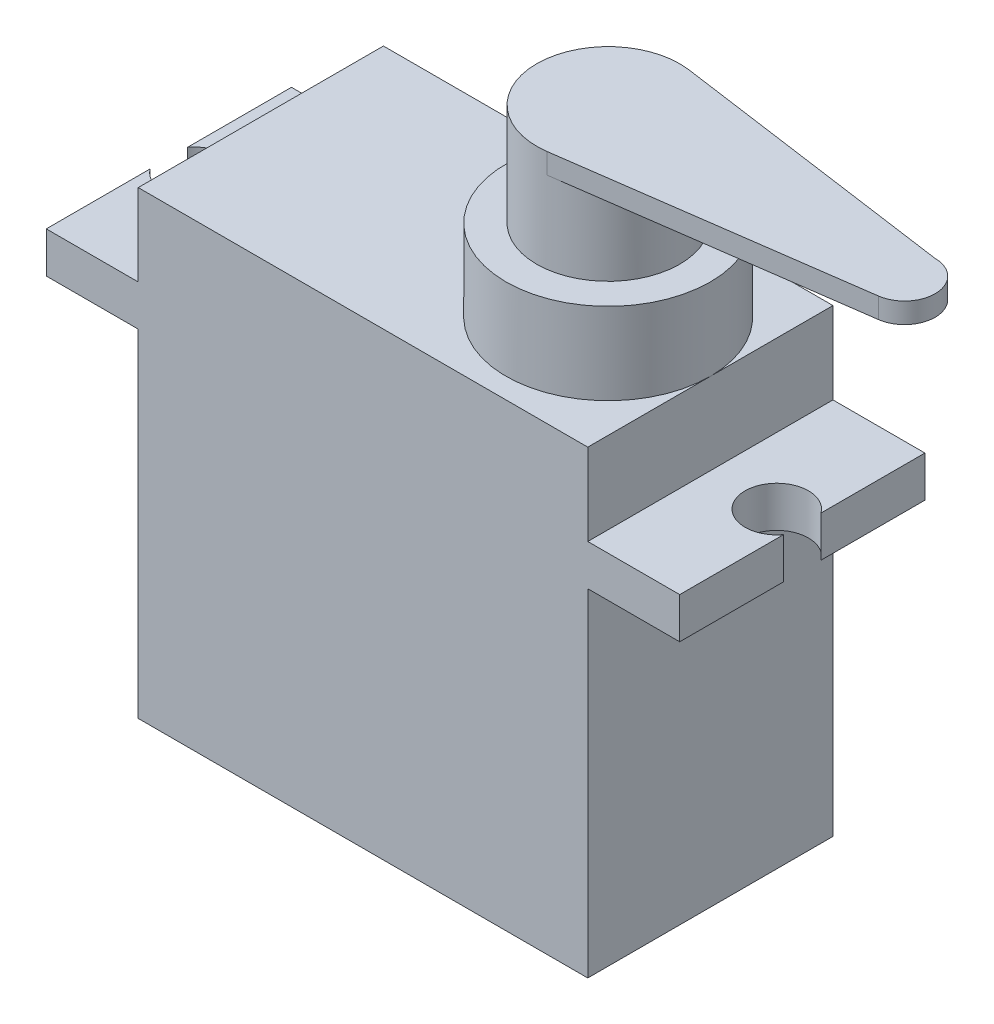
ISO-10303-21;
HEADER;
FILE_DESCRIPTION(('STEP AP214'),'2;1');
FILE_NAME('part.step','',(''),(''),'','','');
FILE_SCHEMA(('AUTOMOTIVE_DESIGN { 1 0 10303 214 1 1 1 1 }'));
ENDSEC;
DATA;
#1=APPLICATION_CONTEXT('core data for automotive mechanical design processes');
#2=APPLICATION_PROTOCOL_DEFINITION('international standard','automotive_design',2000,#1);
#3=PRODUCT_CONTEXT('',#1,'mechanical');
#4=PRODUCT('Part','Part','',(#3));
#5=PRODUCT_RELATED_PRODUCT_CATEGORY('part','',(#4));
#6=PRODUCT_DEFINITION_FORMATION('','',#4);
#7=PRODUCT_DEFINITION_CONTEXT('part definition',#1,'design');
#8=PRODUCT_DEFINITION('design','',#6,#7);
#9=PRODUCT_DEFINITION_SHAPE('','',#8);
#10=(LENGTH_UNIT() NAMED_UNIT(*) SI_UNIT(.MILLI.,.METRE.));
#11=(NAMED_UNIT(*) PLANE_ANGLE_UNIT() SI_UNIT($,.RADIAN.));
#12=(NAMED_UNIT(*) SI_UNIT($,.STERADIAN.) SOLID_ANGLE_UNIT());
#13=UNCERTAINTY_MEASURE_WITH_UNIT(LENGTH_MEASURE(1.E-05),#10,'distance_accuracy_value','');
#14=(GEOMETRIC_REPRESENTATION_CONTEXT(3) GLOBAL_UNCERTAINTY_ASSIGNED_CONTEXT((#13)) GLOBAL_UNIT_ASSIGNED_CONTEXT((#10,
#11,#12)) REPRESENTATION_CONTEXT('',''));
#15=CARTESIAN_POINT('',(0.,0.,0.));
#16=DIRECTION('',(0.,0.,1.));
#17=DIRECTION('',(1.,0.,0.));
#18=AXIS2_PLACEMENT_3D('',#15,#16,#17);
#19=CARTESIAN_POINT('',(-14.25,18.5,0.));
#20=DIRECTION('',(0.,1.,0.));
#21=DIRECTION('',(0.,0.,1.));
#22=AXIS2_PLACEMENT_3D('',#19,#20,#21);
#23=PLANE('',#22);
#24=DIRECTION('',(0.,0.,1.));
#25=VECTOR('',#24,1.);
#26=CARTESIAN_POINT('',(-11.,18.5,-6.));
#27=LINE('',#26,#25);
#28=CARTESIAN_POINT('',(-11.,18.5,-6.));
#29=VERTEX_POINT('',#28);
#30=CARTESIAN_POINT('',(-11.,18.5,6.));
#31=VERTEX_POINT('',#30);
#32=EDGE_CURVE('E214',#29,#31,#27,.T.);
#33=ORIENTED_EDGE('',*,*,#32,.F.);
#34=DIRECTION('',(-1.,0.,0.));
#35=VECTOR('',#34,1.);
#36=CARTESIAN_POINT('',(-15.5,18.5,-6.));
#37=LINE('',#36,#35);
#38=CARTESIAN_POINT('',(-15.5,18.5,-6.));
#39=VERTEX_POINT('',#38);
#40=EDGE_CURVE('E245',#29,#39,#37,.T.);
#41=ORIENTED_EDGE('',*,*,#40,.T.);
#42=DIRECTION('',(0.,0.,1.));
#43=VECTOR('',#42,1.);
#44=CARTESIAN_POINT('',(-15.5,18.5,-6.));
#45=LINE('',#44,#43);
#46=CARTESIAN_POINT('',(-15.5,18.5,-0.916515138991163));
#47=VERTEX_POINT('',#46);
#48=EDGE_CURVE('E248',#39,#47,#45,.T.);
#49=ORIENTED_EDGE('',*,*,#48,.T.);
#50=CARTESIAN_POINT('',(-14.25,18.5,0.));
#51=DIRECTION('',(0.,-1.,0.));
#52=DIRECTION('',(0.,0.,1.));
#53=AXIS2_PLACEMENT_3D('',#50,#51,#52);
#54=CIRCLE('',#53,1.55);
#55=CARTESIAN_POINT('',(-15.5,18.5,0.916515138991162));
#56=VERTEX_POINT('',#55);
#57=EDGE_CURVE('E250',#47,#56,#54,.T.);
#58=ORIENTED_EDGE('',*,*,#57,.T.);
#59=DIRECTION('',(0.,0.,1.));
#60=VECTOR('',#59,1.);
#61=CARTESIAN_POINT('',(-15.5,18.5,0.916515138991162));
#62=LINE('',#61,#60);
#63=CARTESIAN_POINT('',(-15.5,18.5,6.));
#64=VERTEX_POINT('',#63);
#65=EDGE_CURVE('E252',#56,#64,#62,.T.);
#66=ORIENTED_EDGE('',*,*,#65,.T.);
#67=DIRECTION('',(1.,0.,0.));
#68=VECTOR('',#67,1.);
#69=CARTESIAN_POINT('',(-15.5,18.5,6.));
#70=LINE('',#69,#68);
#71=EDGE_CURVE('E255',#64,#31,#70,.T.);
#72=ORIENTED_EDGE('',*,*,#71,.T.);
#73=EDGE_LOOP('',(#33,#41,#49,#58,#66,#72));
#74=FACE_BOUND('',#73,.T.);
#75=ADVANCED_FACE('F33',(#74),#23,.T.);
#76=CARTESIAN_POINT('',(-11.,16.5,-6.));
#77=DIRECTION('',(1.,0.,0.));
#78=DIRECTION('',(0.,0.,-1.));
#79=AXIS2_PLACEMENT_3D('',#76,#77,#78);
#80=PLANE('',#79);
#81=DIRECTION('',(0.,0.,1.));
#82=VECTOR('',#81,1.);
#83=CARTESIAN_POINT('',(-11.,0.,-6.));
#84=LINE('',#83,#82);
#85=CARTESIAN_POINT('',(-11.,0.,-6.));
#86=VERTEX_POINT('',#85);
#87=CARTESIAN_POINT('',(-11.,0.,6.));
#88=VERTEX_POINT('',#87);
#89=EDGE_CURVE('E300',#86,#88,#84,.T.);
#90=ORIENTED_EDGE('',*,*,#89,.T.);
#91=DIRECTION('',(0.,-1.,0.));
#92=VECTOR('',#91,1.);
#93=CARTESIAN_POINT('',(-11.,16.5,6.));
#94=LINE('',#93,#92);
#95=CARTESIAN_POINT('',(-11.,16.5,6.));
#96=VERTEX_POINT('',#95);
#97=EDGE_CURVE('E37',#96,#88,#94,.T.);
#98=ORIENTED_EDGE('',*,*,#97,.F.);
#99=DIRECTION('',(0.,0.,1.));
#100=VECTOR('',#99,1.);
#101=CARTESIAN_POINT('',(-11.,16.5,-6.));
#102=LINE('',#101,#100);
#103=CARTESIAN_POINT('',(-11.,16.5,-6.));
#104=VERTEX_POINT('',#103);
#105=EDGE_CURVE('E301',#104,#96,#102,.T.);
#106=ORIENTED_EDGE('',*,*,#105,.F.);
#107=DIRECTION('',(0.,-1.,0.));
#108=VECTOR('',#107,1.);
#109=CARTESIAN_POINT('',(-11.,16.5,-6.));
#110=LINE('',#109,#108);
#111=EDGE_CURVE('E308',#104,#86,#110,.T.);
#112=ORIENTED_EDGE('',*,*,#111,.T.);
#113=EDGE_LOOP('',(#90,#98,#106,#112));
#114=FACE_BOUND('',#113,.T.);
#115=ADVANCED_FACE('F35',(#114),#80,.F.);
#116=CARTESIAN_POINT('',(-11.,16.5,6.));
#117=DIRECTION('',(0.,0.,-1.));
#118=DIRECTION('',(-1.,0.,0.));
#119=AXIS2_PLACEMENT_3D('',#116,#117,#118);
#120=PLANE('',#119);
#121=DIRECTION('',(1.,0.,0.));
#122=VECTOR('',#121,1.);
#123=CARTESIAN_POINT('',(-11.,0.,6.));
#124=LINE('',#123,#122);
#125=CARTESIAN_POINT('',(11.,0.,6.));
#126=VERTEX_POINT('',#125);
#127=EDGE_CURVE('E311',#88,#126,#124,.T.);
#128=ORIENTED_EDGE('',*,*,#127,.T.);
#129=DIRECTION('',(0.,-1.,0.));
#130=VECTOR('',#129,1.);
#131=CARTESIAN_POINT('',(11.,16.5,6.));
#132=LINE('',#131,#130);
#133=CARTESIAN_POINT('',(11.,16.5,6.));
#134=VERTEX_POINT('',#133);
#135=EDGE_CURVE('E320',#134,#126,#132,.T.);
#136=ORIENTED_EDGE('',*,*,#135,.F.);
#137=DIRECTION('',(1.,0.,0.));
#138=VECTOR('',#137,1.);
#139=CARTESIAN_POINT('',(-15.5,16.5,6.));
#140=LINE('',#139,#138);
#141=CARTESIAN_POINT('',(15.5,16.5,6.));
#142=VERTEX_POINT('',#141);
#143=EDGE_CURVE('E274',#134,#142,#140,.T.);
#144=ORIENTED_EDGE('',*,*,#143,.T.);
#145=DIRECTION('',(0.,-1.,0.));
#146=VECTOR('',#145,1.);
#147=CARTESIAN_POINT('',(15.5,18.5,6.));
#148=LINE('',#147,#146);
#149=CARTESIAN_POINT('',(15.5,18.5,6.));
#150=VERTEX_POINT('',#149);
#151=EDGE_CURVE('E257',#150,#142,#148,.T.);
#152=ORIENTED_EDGE('',*,*,#151,.F.);
#153=CARTESIAN_POINT('',(11.,18.5,6.));
#154=VERTEX_POINT('',#153);
#155=EDGE_CURVE('E254',#154,#150,#70,.T.);
#156=ORIENTED_EDGE('',*,*,#155,.F.);
#157=DIRECTION('',(0.,-1.,0.));
#158=VECTOR('',#157,1.);
#159=CARTESIAN_POINT('',(11.,22.5,6.));
#160=LINE('',#159,#158);
#161=CARTESIAN_POINT('',(11.,22.5,6.));
#162=VERTEX_POINT('',#161);
#163=EDGE_CURVE('E233',#162,#154,#160,.T.);
#164=ORIENTED_EDGE('',*,*,#163,.F.);
#165=DIRECTION('',(1.,0.,0.));
#166=VECTOR('',#165,1.);
#167=CARTESIAN_POINT('',(-11.,22.5,6.));
#168=LINE('',#167,#166);
#169=CARTESIAN_POINT('',(-11.,22.5,6.));
#170=VERTEX_POINT('',#169);
#171=EDGE_CURVE('E210',#170,#162,#168,.T.);
#172=ORIENTED_EDGE('',*,*,#171,.F.);
#173=DIRECTION('',(0.,-1.,0.));
#174=VECTOR('',#173,1.);
#175=CARTESIAN_POINT('',(-11.,22.5,6.));
#176=LINE('',#175,#174);
#177=EDGE_CURVE('E221',#170,#31,#176,.T.);
#178=ORIENTED_EDGE('',*,*,#177,.T.);
#179=ORIENTED_EDGE('',*,*,#71,.F.);
#180=DIRECTION('',(0.,-1.,0.));
#181=VECTOR('',#180,1.);
#182=CARTESIAN_POINT('',(-15.5,18.5,6.));
#183=LINE('',#182,#181);
#184=CARTESIAN_POINT('',(-15.5,16.5,6.));
#185=VERTEX_POINT('',#184);
#186=EDGE_CURVE('E279',#64,#185,#183,.T.);
#187=ORIENTED_EDGE('',*,*,#186,.T.);
#188=EDGE_CURVE('E241',#185,#96,#140,.T.);
#189=ORIENTED_EDGE('',*,*,#188,.T.);
#190=ORIENTED_EDGE('',*,*,#97,.T.);
#191=EDGE_LOOP('',(#128,#136,#144,#152,#156,#164,#172,#178,#179,#187,#189,#190));
#192=FACE_BOUND('',#191,.T.);
#193=ADVANCED_FACE('F327',(#192),#120,.F.);
#194=CARTESIAN_POINT('',(11.,16.5,-6.));
#195=DIRECTION('',(-1.,0.,0.));
#196=DIRECTION('',(0.,0.,1.));
#197=AXIS2_PLACEMENT_3D('',#194,#195,#196);
#198=PLANE('',#197);
#199=DIRECTION('',(0.,0.,-1.));
#200=VECTOR('',#199,1.);
#201=CARTESIAN_POINT('',(11.,0.,-6.));
#202=LINE('',#201,#200);
#203=CARTESIAN_POINT('',(11.,0.,-6.));
#204=VERTEX_POINT('',#203);
#205=EDGE_CURVE('E313',#126,#204,#202,.T.);
#206=ORIENTED_EDGE('',*,*,#205,.T.);
#207=DIRECTION('',(0.,-1.,0.));
#208=VECTOR('',#207,1.);
#209=CARTESIAN_POINT('',(11.,16.5,-6.));
#210=LINE('',#209,#208);
#211=CARTESIAN_POINT('',(11.,16.5,-6.00000000000001));
#212=VERTEX_POINT('',#211);
#213=EDGE_CURVE('E318',#212,#204,#210,.T.);
#214=ORIENTED_EDGE('',*,*,#213,.F.);
#215=DIRECTION('',(0.,0.,-1.));
#216=VECTOR('',#215,1.);
#217=CARTESIAN_POINT('',(11.,16.5,-6.));
#218=LINE('',#217,#216);
#219=EDGE_CURVE('E304',#134,#212,#218,.T.);
#220=ORIENTED_EDGE('',*,*,#219,.F.);
#221=ORIENTED_EDGE('',*,*,#135,.T.);
#222=EDGE_LOOP('',(#206,#214,#220,#221));
#223=FACE_BOUND('',#222,.T.);
#224=ADVANCED_FACE('F335',(#223),#198,.F.);
#225=CARTESIAN_POINT('',(-11.,16.5,-6.));
#226=DIRECTION('',(0.,0.,1.));
#227=DIRECTION('',(1.,0.,0.));
#228=AXIS2_PLACEMENT_3D('',#225,#226,#227);
#229=PLANE('',#228);
#230=DIRECTION('',(-1.,0.,0.));
#231=VECTOR('',#230,1.);
#232=CARTESIAN_POINT('',(-11.,0.,-6.));
#233=LINE('',#232,#231);
#234=EDGE_CURVE('E305',#204,#86,#233,.T.);
#235=ORIENTED_EDGE('',*,*,#234,.T.);
#236=ORIENTED_EDGE('',*,*,#111,.F.);
#237=DIRECTION('',(-1.,0.,0.));
#238=VECTOR('',#237,1.);
#239=CARTESIAN_POINT('',(-15.5,16.5,-6.));
#240=LINE('',#239,#238);
#241=CARTESIAN_POINT('',(-15.5,16.5,-6.));
#242=VERTEX_POINT('',#241);
#243=EDGE_CURVE('E264',#104,#242,#240,.T.);
#244=ORIENTED_EDGE('',*,*,#243,.T.);
#245=DIRECTION('',(0.,-1.,0.));
#246=VECTOR('',#245,1.);
#247=CARTESIAN_POINT('',(-15.5,18.5,-6.));
#248=LINE('',#247,#246);
#249=EDGE_CURVE('E288',#39,#242,#248,.T.);
#250=ORIENTED_EDGE('',*,*,#249,.F.);
#251=ORIENTED_EDGE('',*,*,#40,.F.);
#252=DIRECTION('',(0.,-1.,0.));
#253=VECTOR('',#252,1.);
#254=CARTESIAN_POINT('',(-11.,22.5,-6.));
#255=LINE('',#254,#253);
#256=CARTESIAN_POINT('',(-11.,22.5,-6.));
#257=VERTEX_POINT('',#256);
#258=EDGE_CURVE('E227',#257,#29,#255,.T.);
#259=ORIENTED_EDGE('',*,*,#258,.F.);
#260=DIRECTION('',(-1.,0.,0.));
#261=VECTOR('',#260,1.);
#262=CARTESIAN_POINT('',(11.,22.5,-6.));
#263=LINE('',#262,#261);
#264=CARTESIAN_POINT('',(11.,22.5,-6.));
#265=VERTEX_POINT('',#264);
#266=EDGE_CURVE('E217',#265,#257,#263,.T.);
#267=ORIENTED_EDGE('',*,*,#266,.F.);
#268=DIRECTION('',(0.,-1.,0.));
#269=VECTOR('',#268,1.);
#270=CARTESIAN_POINT('',(11.,22.5,-6.));
#271=LINE('',#270,#269);
#272=CARTESIAN_POINT('',(11.,18.5,-6.));
#273=VERTEX_POINT('',#272);
#274=EDGE_CURVE('E230',#265,#273,#271,.T.);
#275=ORIENTED_EDGE('',*,*,#274,.T.);
#276=CARTESIAN_POINT('',(15.5,18.5,-6.00000000000001));
#277=VERTEX_POINT('',#276);
#278=EDGE_CURVE('E246',#277,#273,#37,.T.);
#279=ORIENTED_EDGE('',*,*,#278,.F.);
#280=DIRECTION('',(0.,-1.,0.));
#281=VECTOR('',#280,1.);
#282=CARTESIAN_POINT('',(15.5,18.5,-6.00000000000001));
#283=LINE('',#282,#281);
#284=CARTESIAN_POINT('',(15.5,16.5,-6.00000000000001));
#285=VERTEX_POINT('',#284);
#286=EDGE_CURVE('E291',#277,#285,#283,.T.);
#287=ORIENTED_EDGE('',*,*,#286,.T.);
#288=EDGE_CURVE('E265',#285,#212,#240,.T.);
#289=ORIENTED_EDGE('',*,*,#288,.T.);
#290=ORIENTED_EDGE('',*,*,#213,.T.);
#291=EDGE_LOOP('',(#235,#236,#244,#250,#251,#259,#267,#275,#279,#287,#289,#290));
#292=FACE_BOUND('',#291,.T.);
#293=ADVANCED_FACE('F337',(#292),#229,.F.);
#294=CARTESIAN_POINT('',(0.,0.,0.));
#295=DIRECTION('',(0.,1.,0.));
#296=DIRECTION('',(0.,0.,1.));
#297=AXIS2_PLACEMENT_3D('',#294,#295,#296);
#298=PLANE('',#297);
#299=ORIENTED_EDGE('',*,*,#89,.F.);
#300=ORIENTED_EDGE('',*,*,#234,.F.);
#301=ORIENTED_EDGE('',*,*,#205,.F.);
#302=ORIENTED_EDGE('',*,*,#127,.F.);
#303=EDGE_LOOP('',(#299,#300,#301,#302));
#304=FACE_BOUND('',#303,.T.);
#305=ADVANCED_FACE('F334',(#304),#298,.F.);
#306=CARTESIAN_POINT('',(-14.25,16.5,0.));
#307=DIRECTION('',(0.,1.,0.));
#308=DIRECTION('',(0.,0.,1.));
#309=AXIS2_PLACEMENT_3D('',#306,#307,#308);
#310=PLANE('',#309);
#311=ORIENTED_EDGE('',*,*,#243,.F.);
#312=ORIENTED_EDGE('',*,*,#105,.T.);
#313=ORIENTED_EDGE('',*,*,#188,.F.);
#314=DIRECTION('',(0.,0.,1.));
#315=VECTOR('',#314,1.);
#316=CARTESIAN_POINT('',(-15.5,16.5,0.916515138991162));
#317=LINE('',#316,#315);
#318=CARTESIAN_POINT('',(-15.5,16.5,0.916515138991162));
#319=VERTEX_POINT('',#318);
#320=EDGE_CURVE('E272',#319,#185,#317,.T.);
#321=ORIENTED_EDGE('',*,*,#320,.F.);
#322=CARTESIAN_POINT('',(-14.25,16.5,0.));
#323=DIRECTION('',(0.,-1.,0.));
#324=DIRECTION('',(0.,0.,1.));
#325=AXIS2_PLACEMENT_3D('',#322,#323,#324);
#326=CIRCLE('',#325,1.55);
#327=CARTESIAN_POINT('',(-15.5,16.5,-0.916515138991163));
#328=VERTEX_POINT('',#327);
#329=EDGE_CURVE('E270',#328,#319,#326,.T.);
#330=ORIENTED_EDGE('',*,*,#329,.F.);
#331=DIRECTION('',(0.,0.,1.));
#332=VECTOR('',#331,1.);
#333=CARTESIAN_POINT('',(-15.5,16.5,-6.));
#334=LINE('',#333,#332);
#335=EDGE_CURVE('E268',#242,#328,#334,.T.);
#336=ORIENTED_EDGE('',*,*,#335,.F.);
#337=EDGE_LOOP('',(#311,#312,#313,#321,#330,#336));
#338=FACE_BOUND('',#337,.T.);
#339=ADVANCED_FACE('F389',(#338),#310,.F.);
#340=ORIENTED_EDGE('',*,*,#143,.F.);
#341=ORIENTED_EDGE('',*,*,#219,.T.);
#342=ORIENTED_EDGE('',*,*,#288,.F.);
#343=DIRECTION('',(0.,0.,-1.));
#344=VECTOR('',#343,1.);
#345=CARTESIAN_POINT('',(15.5,16.5,-6.00000000000001));
#346=LINE('',#345,#344);
#347=CARTESIAN_POINT('',(15.5,16.5,-0.916515138991161));
#348=VERTEX_POINT('',#347);
#349=EDGE_CURVE('E262',#348,#285,#346,.T.);
#350=ORIENTED_EDGE('',*,*,#349,.F.);
#351=CARTESIAN_POINT('',(14.25,16.5,0.));
#352=DIRECTION('',(0.,-1.,0.));
#353=DIRECTION('',(0.,0.,-1.));
#354=AXIS2_PLACEMENT_3D('',#351,#352,#353);
#355=CIRCLE('',#354,1.55);
#356=CARTESIAN_POINT('',(15.5,16.5,0.916515138991159));
#357=VERTEX_POINT('',#356);
#358=EDGE_CURVE('E260',#357,#348,#355,.T.);
#359=ORIENTED_EDGE('',*,*,#358,.F.);
#360=DIRECTION('',(0.,0.,-1.));
#361=VECTOR('',#360,1.);
#362=CARTESIAN_POINT('',(15.5,16.5,0.916515138991159));
#363=LINE('',#362,#361);
#364=EDGE_CURVE('E236',#142,#357,#363,.T.);
#365=ORIENTED_EDGE('',*,*,#364,.F.);
#366=EDGE_LOOP('',(#340,#341,#342,#350,#359,#365));
#367=FACE_BOUND('',#366,.T.);
#368=ADVANCED_FACE('F344',(#367),#310,.F.);
#369=CARTESIAN_POINT('',(15.5,18.5,0.916515138991159));
#370=DIRECTION('',(-1.,0.,0.));
#371=DIRECTION('',(0.,0.,1.));
#372=AXIS2_PLACEMENT_3D('',#369,#370,#371);
#373=PLANE('',#372);
#374=ORIENTED_EDGE('',*,*,#364,.T.);
#375=DIRECTION('',(0.,-1.,0.));
#376=VECTOR('',#375,1.);
#377=CARTESIAN_POINT('',(15.5,18.5,0.916515138991159));
#378=LINE('',#377,#376);
#379=CARTESIAN_POINT('',(15.5,18.5,0.916515138991159));
#380=VERTEX_POINT('',#379);
#381=EDGE_CURVE('E297',#380,#357,#378,.T.);
#382=ORIENTED_EDGE('',*,*,#381,.F.);
#383=DIRECTION('',(0.,0.,-1.));
#384=VECTOR('',#383,1.);
#385=CARTESIAN_POINT('',(15.5,18.5,0.916515138991159));
#386=LINE('',#385,#384);
#387=EDGE_CURVE('E237',#150,#380,#386,.T.);
#388=ORIENTED_EDGE('',*,*,#387,.F.);
#389=ORIENTED_EDGE('',*,*,#151,.T.);
#390=EDGE_LOOP('',(#374,#382,#388,#389));
#391=FACE_BOUND('',#390,.T.);
#392=ADVANCED_FACE('F349',(#391),#373,.F.);
#393=CARTESIAN_POINT('',(14.25,18.5,0.));
#394=DIRECTION('',(0.,-1.,0.));
#395=DIRECTION('',(0.,0.,-1.));
#396=AXIS2_PLACEMENT_3D('',#393,#394,#395);
#397=CYLINDRICAL_SURFACE('',#396,1.55);
#398=ORIENTED_EDGE('',*,*,#358,.T.);
#399=DIRECTION('',(0.,-1.,0.));
#400=VECTOR('',#399,1.);
#401=CARTESIAN_POINT('',(15.5,18.5,-0.916515138991161));
#402=LINE('',#401,#400);
#403=CARTESIAN_POINT('',(15.5,18.5,-0.916515138991161));
#404=VERTEX_POINT('',#403);
#405=EDGE_CURVE('E294',#404,#348,#402,.T.);
#406=ORIENTED_EDGE('',*,*,#405,.F.);
#407=CARTESIAN_POINT('',(14.25,18.5,0.));
#408=DIRECTION('',(0.,-1.,0.));
#409=DIRECTION('',(0.,0.,-1.));
#410=AXIS2_PLACEMENT_3D('',#407,#408,#409);
#411=CIRCLE('',#410,1.55);
#412=EDGE_CURVE('E240',#380,#404,#411,.T.);
#413=ORIENTED_EDGE('',*,*,#412,.F.);
#414=ORIENTED_EDGE('',*,*,#381,.T.);
#415=EDGE_LOOP('',(#398,#406,#413,#414));
#416=FACE_BOUND('',#415,.T.);
#417=ADVANCED_FACE('F422',(#416),#397,.F.);
#418=CARTESIAN_POINT('',(15.5,18.5,-6.00000000000001));
#419=DIRECTION('',(-1.,0.,0.));
#420=DIRECTION('',(0.,0.,1.));
#421=AXIS2_PLACEMENT_3D('',#418,#419,#420);
#422=PLANE('',#421);
#423=ORIENTED_EDGE('',*,*,#349,.T.);
#424=ORIENTED_EDGE('',*,*,#286,.F.);
#425=DIRECTION('',(0.,0.,-1.));
#426=VECTOR('',#425,1.);
#427=CARTESIAN_POINT('',(15.5,18.5,-6.00000000000001));
#428=LINE('',#427,#426);
#429=EDGE_CURVE('E243',#404,#277,#428,.T.);
#430=ORIENTED_EDGE('',*,*,#429,.F.);
#431=ORIENTED_EDGE('',*,*,#405,.T.);
#432=EDGE_LOOP('',(#423,#424,#430,#431));
#433=FACE_BOUND('',#432,.T.);
#434=ADVANCED_FACE('F419',(#433),#422,.F.);
#435=CARTESIAN_POINT('',(-15.5,18.5,-6.));
#436=DIRECTION('',(1.,0.,0.));
#437=DIRECTION('',(0.,0.,-1.));
#438=AXIS2_PLACEMENT_3D('',#435,#436,#437);
#439=PLANE('',#438);
#440=ORIENTED_EDGE('',*,*,#335,.T.);
#441=DIRECTION('',(0.,-1.,0.));
#442=VECTOR('',#441,1.);
#443=CARTESIAN_POINT('',(-15.5,18.5,-0.916515138991163));
#444=LINE('',#443,#442);
#445=EDGE_CURVE('E285',#47,#328,#444,.T.);
#446=ORIENTED_EDGE('',*,*,#445,.F.);
#447=ORIENTED_EDGE('',*,*,#48,.F.);
#448=ORIENTED_EDGE('',*,*,#249,.T.);
#449=EDGE_LOOP('',(#440,#446,#447,#448));
#450=FACE_BOUND('',#449,.T.);
#451=ADVANCED_FACE('F377',(#450),#439,.F.);
#452=CARTESIAN_POINT('',(-14.25,18.5,0.));
#453=DIRECTION('',(0.,-1.,0.));
#454=DIRECTION('',(0.,0.,-1.));
#455=AXIS2_PLACEMENT_3D('',#452,#453,#454);
#456=CYLINDRICAL_SURFACE('',#455,1.55);
#457=ORIENTED_EDGE('',*,*,#329,.T.);
#458=DIRECTION('',(0.,-1.,0.));
#459=VECTOR('',#458,1.);
#460=CARTESIAN_POINT('',(-15.5,18.5,0.916515138991162));
#461=LINE('',#460,#459);
#462=EDGE_CURVE('E282',#56,#319,#461,.T.);
#463=ORIENTED_EDGE('',*,*,#462,.F.);
#464=ORIENTED_EDGE('',*,*,#57,.F.);
#465=ORIENTED_EDGE('',*,*,#445,.T.);
#466=EDGE_LOOP('',(#457,#463,#464,#465));
#467=FACE_BOUND('',#466,.T.);
#468=ADVANCED_FACE('F383',(#467),#456,.F.);
#469=CARTESIAN_POINT('',(-15.5,18.5,0.916515138991162));
#470=DIRECTION('',(1.,0.,0.));
#471=DIRECTION('',(0.,0.,-1.));
#472=AXIS2_PLACEMENT_3D('',#469,#470,#471);
#473=PLANE('',#472);
#474=ORIENTED_EDGE('',*,*,#320,.T.);
#475=ORIENTED_EDGE('',*,*,#186,.F.);
#476=ORIENTED_EDGE('',*,*,#65,.F.);
#477=ORIENTED_EDGE('',*,*,#462,.T.);
#478=EDGE_LOOP('',(#474,#475,#476,#477));
#479=FACE_BOUND('',#478,.T.);
#480=ADVANCED_FACE('F387',(#479),#473,.F.);
#481=DIRECTION('',(0.,0.,-1.));
#482=VECTOR('',#481,1.);
#483=CARTESIAN_POINT('',(11.,18.5,6.));
#484=LINE('',#483,#482);
#485=EDGE_CURVE('E57',#154,#273,#484,.T.);
#486=ORIENTED_EDGE('',*,*,#485,.F.);
#487=ORIENTED_EDGE('',*,*,#155,.T.);
#488=ORIENTED_EDGE('',*,*,#387,.T.);
#489=ORIENTED_EDGE('',*,*,#412,.T.);
#490=ORIENTED_EDGE('',*,*,#429,.T.);
#491=ORIENTED_EDGE('',*,*,#278,.T.);
#492=EDGE_LOOP('',(#486,#487,#488,#489,#490,#491));
#493=FACE_BOUND('',#492,.T.);
#494=ADVANCED_FACE('F351',(#493),#23,.T.);
#495=CARTESIAN_POINT('',(11.,22.5,6.));
#496=DIRECTION('',(-1.,0.,0.));
#497=DIRECTION('',(0.,0.,1.));
#498=AXIS2_PLACEMENT_3D('',#495,#496,#497);
#499=PLANE('',#498);
#500=ORIENTED_EDGE('',*,*,#485,.T.);
#501=ORIENTED_EDGE('',*,*,#274,.F.);
#502=DIRECTION('',(0.,0.,-1.));
#503=VECTOR('',#502,1.);
#504=CARTESIAN_POINT('',(11.,22.5,6.));
#505=LINE('',#504,#503);
#506=CARTESIAN_POINT('',(11.,22.5,0.));
#507=VERTEX_POINT('',#506);
#508=EDGE_CURVE('E213',#507,#265,#505,.T.);
#509=ORIENTED_EDGE('',*,*,#508,.F.);
#510=EDGE_CURVE('E215',#162,#507,#505,.T.);
#511=ORIENTED_EDGE('',*,*,#510,.F.);
#512=ORIENTED_EDGE('',*,*,#163,.T.);
#513=EDGE_LOOP('',(#500,#501,#509,#511,#512));
#514=FACE_BOUND('',#513,.T.);
#515=ADVANCED_FACE('F356',(#514),#499,.F.);
#516=CARTESIAN_POINT('',(-11.,22.5,-6.));
#517=DIRECTION('',(1.,0.,0.));
#518=DIRECTION('',(0.,0.,-1.));
#519=AXIS2_PLACEMENT_3D('',#516,#517,#518);
#520=PLANE('',#519);
#521=ORIENTED_EDGE('',*,*,#32,.T.);
#522=ORIENTED_EDGE('',*,*,#177,.F.);
#523=DIRECTION('',(0.,0.,1.));
#524=VECTOR('',#523,1.);
#525=CARTESIAN_POINT('',(-11.,22.5,-6.));
#526=LINE('',#525,#524);
#527=EDGE_CURVE('E219',#257,#170,#526,.T.);
#528=ORIENTED_EDGE('',*,*,#527,.F.);
#529=ORIENTED_EDGE('',*,*,#258,.T.);
#530=EDGE_LOOP('',(#521,#522,#528,#529));
#531=FACE_BOUND('',#530,.T.);
#532=ADVANCED_FACE('F366',(#531),#520,.F.);
#533=CARTESIAN_POINT('',(0.,22.5,0.));
#534=DIRECTION('',(0.,1.,0.));
#535=DIRECTION('',(0.,0.,1.));
#536=AXIS2_PLACEMENT_3D('',#533,#534,#535);
#537=PLANE('',#536);
#538=ORIENTED_EDGE('',*,*,#510,.T.);
#539=CARTESIAN_POINT('',(6.,22.5,0.));
#540=DIRECTION('',(0.,1.,0.));
#541=DIRECTION('',(0.,0.,1.));
#542=AXIS2_PLACEMENT_3D('',#539,#540,#541);
#543=CIRCLE('',#542,5.);
#544=EDGE_CURVE('E199',#507,#507,#543,.T.);
#545=ORIENTED_EDGE('',*,*,#544,.F.);
#546=ORIENTED_EDGE('',*,*,#508,.T.);
#547=ORIENTED_EDGE('',*,*,#266,.T.);
#548=ORIENTED_EDGE('',*,*,#527,.T.);
#549=ORIENTED_EDGE('',*,*,#171,.T.);
#550=EDGE_LOOP('',(#538,#545,#546,#547,#548,#549));
#551=FACE_BOUND('',#550,.T.);
#552=ADVANCED_FACE('F361',(#551),#537,.T.);
#553=CARTESIAN_POINT('',(6.,26.5,0.));
#554=DIRECTION('',(0.,-1.,0.));
#555=DIRECTION('',(0.,0.,-1.));
#556=AXIS2_PLACEMENT_3D('',#553,#554,#555);
#557=CYLINDRICAL_SURFACE('',#556,5.);
#558=CARTESIAN_POINT('',(6.,26.5,0.));
#559=DIRECTION('',(0.,1.,0.));
#560=DIRECTION('',(0.,0.,1.));
#561=AXIS2_PLACEMENT_3D('',#558,#559,#560);
#562=CIRCLE('',#561,5.);
#563=CARTESIAN_POINT('',(6.,26.5,5.));
#564=VERTEX_POINT('',#563);
#565=EDGE_CURVE('E205',#564,#564,#562,.T.);
#566=ORIENTED_EDGE('',*,*,#565,.F.);
#567=EDGE_LOOP('',(#566));
#568=FACE_BOUND('',#567,.T.);
#569=ORIENTED_EDGE('',*,*,#544,.T.);
#570=EDGE_LOOP('',(#569));
#571=FACE_BOUND('',#570,.T.);
#572=ADVANCED_FACE('F454',(#568,#571),#557,.T.);
#573=CARTESIAN_POINT('',(6.,26.5,0.));
#574=DIRECTION('',(0.,1.,0.));
#575=DIRECTION('',(0.,0.,1.));
#576=AXIS2_PLACEMENT_3D('',#573,#574,#575);
#577=PLANE('',#576);
#578=CARTESIAN_POINT('',(6.,26.5,0.));
#579=DIRECTION('',(0.,1.,0.));
#580=DIRECTION('',(0.,0.,1.));
#581=AXIS2_PLACEMENT_3D('',#578,#579,#580);
#582=CIRCLE('',#581,3.5);
#583=CARTESIAN_POINT('',(6.,26.5,3.5));
#584=VERTEX_POINT('',#583);
#585=EDGE_CURVE('E11',#584,#584,#582,.T.);
#586=ORIENTED_EDGE('',*,*,#585,.F.);
#587=EDGE_LOOP('',(#586));
#588=FACE_BOUND('',#587,.T.);
#589=ORIENTED_EDGE('',*,*,#565,.T.);
#590=EDGE_LOOP('',(#589));
#591=FACE_BOUND('',#590,.T.);
#592=ADVANCED_FACE('F461',(#588,#591),#577,.T.);
#593=CARTESIAN_POINT('',(6.,30.5,0.));
#594=DIRECTION('',(0.,-1.,0.));
#595=DIRECTION('',(0.,0.,-1.));
#596=AXIS2_PLACEMENT_3D('',#593,#594,#595);
#597=CYLINDRICAL_SURFACE('',#596,3.5);
#598=CARTESIAN_POINT('',(6.,30.5,0.));
#599=DIRECTION('',(0.,1.,0.));
#600=DIRECTION('',(0.,0.,1.));
#601=AXIS2_PLACEMENT_3D('',#598,#599,#600);
#602=CIRCLE('',#601,3.5);
#603=CARTESIAN_POINT('',(6.48359261200003,30.5,3.46643017896207));
#604=VERTEX_POINT('',#603);
#605=CARTESIAN_POINT('',(6.48710585336025,30.5,-3.46593824059549));
#606=VERTEX_POINT('',#605);
#607=EDGE_CURVE('E49',#604,#606,#602,.T.);
#608=ORIENTED_EDGE('',*,*,#607,.F.);
#609=DIRECTION('',(0.,-1.,0.));
#610=VECTOR('',#609,1.);
#611=CARTESIAN_POINT('',(6.48359261200003,31.5,3.46643017896207));
#612=LINE('',#611,#610);
#613=CARTESIAN_POINT('',(6.48359261200003,31.5,3.46643017896207));
#614=VERTEX_POINT('',#613);
#615=EDGE_CURVE('E179',#614,#604,#612,.T.);
#616=ORIENTED_EDGE('',*,*,#615,.F.);
#617=CARTESIAN_POINT('',(6.,31.5,0.));
#618=DIRECTION('',(0.,1.,0.));
#619=DIRECTION('',(0.,0.,1.));
#620=AXIS2_PLACEMENT_3D('',#617,#618,#619);
#621=CIRCLE('',#620,3.5);
#622=CARTESIAN_POINT('',(6.48710585336025,31.5,-3.46593824059549));
#623=VERTEX_POINT('',#622);
#624=EDGE_CURVE('E185',#623,#614,#621,.T.);
#625=ORIENTED_EDGE('',*,*,#624,.F.);
#626=DIRECTION('',(0.,-1.,0.));
#627=VECTOR('',#626,1.);
#628=CARTESIAN_POINT('',(6.48710585336025,31.5,-3.46593824059549));
#629=LINE('',#628,#627);
#630=EDGE_CURVE('E629',#623,#606,#629,.T.);
#631=ORIENTED_EDGE('',*,*,#630,.T.);
#632=EDGE_LOOP('',(#608,#616,#625,#631));
#633=FACE_BOUND('',#632,.T.);
#634=ORIENTED_EDGE('',*,*,#585,.T.);
#635=EDGE_LOOP('',(#634));
#636=FACE_BOUND('',#635,.T.);
#637=ADVANCED_FACE('F196',(#633,#636),#597,.T.);
#638=CARTESIAN_POINT('',(6.,30.5,0.));
#639=DIRECTION('',(0.,1.,0.));
#640=DIRECTION('',(0.,0.,1.));
#641=AXIS2_PLACEMENT_3D('',#638,#639,#640);
#642=PLANE('',#641);
#643=DIRECTION('',(0.990408622560591,0.,-0.138169317714294));
#644=VECTOR('',#643,1.);
#645=CARTESIAN_POINT('',(6.48359261200003,30.5,3.46643017896207));
#646=LINE('',#645,#644);
#647=CARTESIAN_POINT('',(20.7107090834287,30.5,1.48164235389561));
#648=VERTEX_POINT('',#647);
#649=EDGE_CURVE('E638',#604,#648,#646,.T.);
#650=ORIENTED_EDGE('',*,*,#649,.F.);
#651=ORIENTED_EDGE('',*,*,#607,.T.);
#652=DIRECTION('',(-0.99026806874157,0.,-0.139173100960069));
#653=VECTOR('',#652,1.);
#654=CARTESIAN_POINT('',(20.5040090320852,30.5,-1.49599096791483));
#655=LINE('',#654,#653);
#656=CARTESIAN_POINT('',(20.5040090320852,30.5,-1.49599096791483));
#657=VERTEX_POINT('',#656);
#658=EDGE_CURVE('E194',#657,#606,#655,.T.);
#659=ORIENTED_EDGE('',*,*,#658,.F.);
#660=CARTESIAN_POINT('',(20.5040090320852,30.5,0.));
#661=DIRECTION('',(0.,1.,0.));
#662=DIRECTION('',(0.,0.,-1.));
#663=AXIS2_PLACEMENT_3D('',#660,#661,#662);
#664=CIRCLE('',#663,1.49599096791483);
#665=EDGE_CURVE('E632',#648,#657,#664,.T.);
#666=ORIENTED_EDGE('',*,*,#665,.F.);
#667=EDGE_LOOP('',(#650,#651,#659,#666));
#668=FACE_BOUND('',#667,.T.);
#669=ADVANCED_FACE('F477',(#668),#642,.F.);
#670=CARTESIAN_POINT('',(6.48359261200003,31.5,3.46643017896207));
#671=DIRECTION('',(-0.138169317714294,0.,-0.990408622560591));
#672=DIRECTION('',(-0.990408622560591,0.,0.138169317714294));
#673=AXIS2_PLACEMENT_3D('',#670,#671,#672);
#674=PLANE('',#673);
#675=ORIENTED_EDGE('',*,*,#649,.T.);
#676=DIRECTION('',(0.,-1.,0.));
#677=VECTOR('',#676,1.);
#678=CARTESIAN_POINT('',(20.7107090834287,31.5,1.48164235389561));
#679=LINE('',#678,#677);
#680=CARTESIAN_POINT('',(20.7107090834287,31.5,1.48164235389561));
#681=VERTEX_POINT('',#680);
#682=EDGE_CURVE('E181',#681,#648,#679,.T.);
#683=ORIENTED_EDGE('',*,*,#682,.F.);
#684=DIRECTION('',(0.990408622560591,0.,-0.138169317714294));
#685=VECTOR('',#684,1.);
#686=CARTESIAN_POINT('',(6.48359261200003,31.5,3.46643017896207));
#687=LINE('',#686,#685);
#688=EDGE_CURVE('E175',#614,#681,#687,.T.);
#689=ORIENTED_EDGE('',*,*,#688,.F.);
#690=ORIENTED_EDGE('',*,*,#615,.T.);
#691=EDGE_LOOP('',(#675,#683,#689,#690));
#692=FACE_BOUND('',#691,.T.);
#693=ADVANCED_FACE('F177',(#692),#674,.F.);
#694=CARTESIAN_POINT('',(20.5040090320852,31.5,0.));
#695=DIRECTION('',(0.,-1.,0.));
#696=DIRECTION('',(0.,0.,-1.));
#697=AXIS2_PLACEMENT_3D('',#694,#695,#696);
#698=CYLINDRICAL_SURFACE('',#697,1.49599096791483);
#699=ORIENTED_EDGE('',*,*,#665,.T.);
#700=DIRECTION('',(0.,-1.,0.));
#701=VECTOR('',#700,1.);
#702=CARTESIAN_POINT('',(20.5040090320852,31.5,-1.49599096791483));
#703=LINE('',#702,#701);
#704=CARTESIAN_POINT('',(20.5040090320852,31.5,-1.49599096791483));
#705=VERTEX_POINT('',#704);
#706=EDGE_CURVE('E201',#705,#657,#703,.T.);
#707=ORIENTED_EDGE('',*,*,#706,.F.);
#708=CARTESIAN_POINT('',(20.5040090320852,31.5,0.));
#709=DIRECTION('',(0.,1.,0.));
#710=DIRECTION('',(0.,0.,-1.));
#711=AXIS2_PLACEMENT_3D('',#708,#709,#710);
#712=CIRCLE('',#711,1.49599096791483);
#713=EDGE_CURVE('E184',#681,#705,#712,.T.);
#714=ORIENTED_EDGE('',*,*,#713,.F.);
#715=ORIENTED_EDGE('',*,*,#682,.T.);
#716=EDGE_LOOP('',(#699,#707,#714,#715));
#717=FACE_BOUND('',#716,.T.);
#718=ADVANCED_FACE('F491',(#717),#698,.T.);
#719=CARTESIAN_POINT('',(20.5040090320852,31.5,-1.49599096791483));
#720=DIRECTION('',(-0.139173100960069,0.,0.99026806874157));
#721=DIRECTION('',(0.99026806874157,0.,0.139173100960069));
#722=AXIS2_PLACEMENT_3D('',#719,#720,#721);
#723=PLANE('',#722);
#724=ORIENTED_EDGE('',*,*,#658,.T.);
#725=ORIENTED_EDGE('',*,*,#630,.F.);
#726=DIRECTION('',(-0.99026806874157,0.,-0.139173100960069));
#727=VECTOR('',#726,1.);
#728=CARTESIAN_POINT('',(20.5040090320852,31.5,-1.49599096791483));
#729=LINE('',#728,#727);
#730=EDGE_CURVE('E190',#705,#623,#729,.T.);
#731=ORIENTED_EDGE('',*,*,#730,.F.);
#732=ORIENTED_EDGE('',*,*,#706,.T.);
#733=EDGE_LOOP('',(#724,#725,#731,#732));
#734=FACE_BOUND('',#733,.T.);
#735=ADVANCED_FACE('F498',(#734),#723,.F.);
#736=CARTESIAN_POINT('',(6.,31.5,0.));
#737=DIRECTION('',(0.,1.,0.));
#738=DIRECTION('',(0.,0.,1.));
#739=AXIS2_PLACEMENT_3D('',#736,#737,#738);
#740=PLANE('',#739);
#741=ORIENTED_EDGE('',*,*,#730,.T.);
#742=ORIENTED_EDGE('',*,*,#624,.T.);
#743=ORIENTED_EDGE('',*,*,#688,.T.);
#744=ORIENTED_EDGE('',*,*,#713,.T.);
#745=EDGE_LOOP('',(#741,#742,#743,#744));
#746=FACE_BOUND('',#745,.T.);
#747=ADVANCED_FACE('F188',(#746),#740,.T.);
#748=CLOSED_SHELL('',(#75,#115,#193,#224,#293,#305,#339,#368,#392,#417,#434,#451,#468,#480,#494,
#515,#532,#552,#572,#592,#637,#669,#693,#718,#735,#747));
#749=MANIFOLD_SOLID_BREP('B2',#748);
#750=ADVANCED_BREP_SHAPE_REPRESENTATION('',(#18,#749),#14);
#751=SHAPE_DEFINITION_REPRESENTATION(#9,#750);
ENDSEC;
END-ISO-10303-21;
